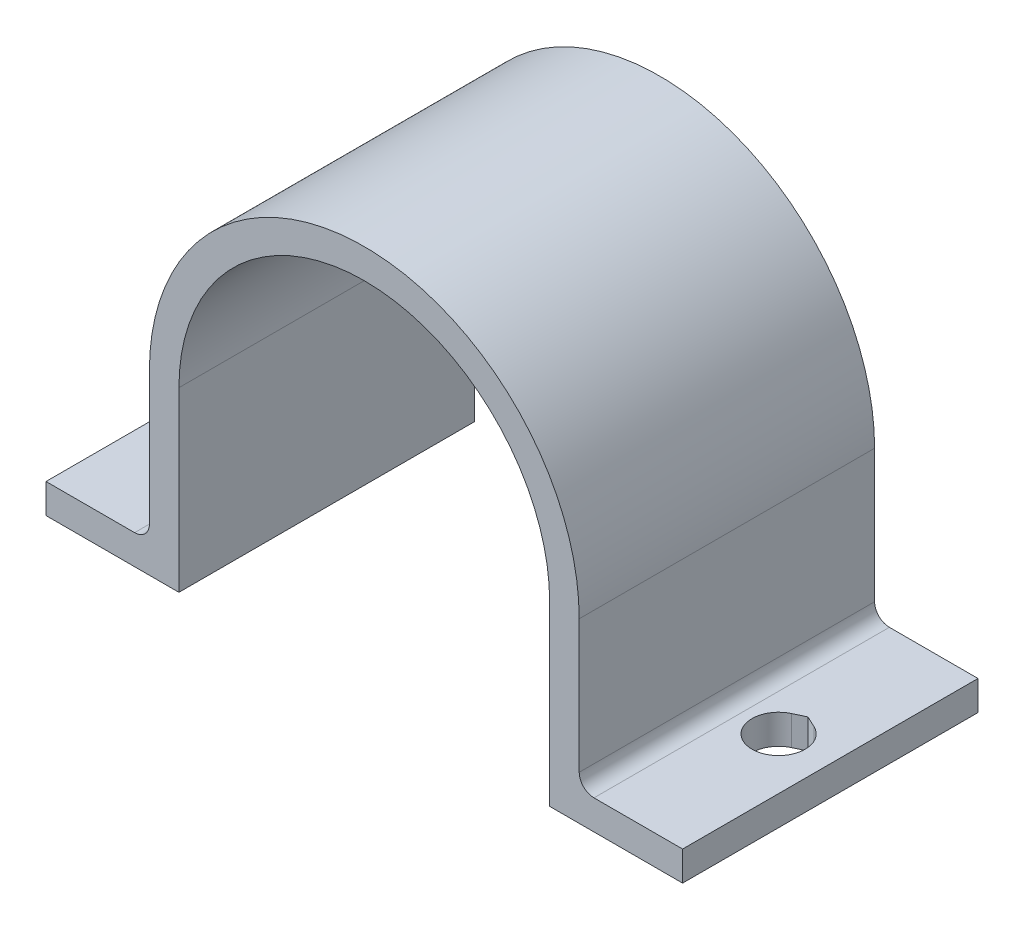
ISO-10303-21;
HEADER;
FILE_DESCRIPTION(('STEP AP214'),'2;1');
FILE_NAME('part.step','',(''),(''),'','','');
FILE_SCHEMA(('AUTOMOTIVE_DESIGN { 1 0 10303 214 1 1 1 1 }'));
ENDSEC;
DATA;
#1=APPLICATION_CONTEXT('core data for automotive mechanical design processes');
#2=APPLICATION_PROTOCOL_DEFINITION('international standard','automotive_design',2000,#1);
#3=PRODUCT_CONTEXT('',#1,'mechanical');
#4=PRODUCT('Part','Part','',(#3));
#5=PRODUCT_RELATED_PRODUCT_CATEGORY('part','',(#4));
#6=PRODUCT_DEFINITION_FORMATION('','',#4);
#7=PRODUCT_DEFINITION_CONTEXT('part definition',#1,'design');
#8=PRODUCT_DEFINITION('design','',#6,#7);
#9=PRODUCT_DEFINITION_SHAPE('','',#8);
#10=(LENGTH_UNIT() NAMED_UNIT(*) SI_UNIT(.MILLI.,.METRE.));
#11=(NAMED_UNIT(*) PLANE_ANGLE_UNIT() SI_UNIT($,.RADIAN.));
#12=(NAMED_UNIT(*) SI_UNIT($,.STERADIAN.) SOLID_ANGLE_UNIT());
#13=UNCERTAINTY_MEASURE_WITH_UNIT(LENGTH_MEASURE(1.E-05),#10,'distance_accuracy_value','');
#14=(GEOMETRIC_REPRESENTATION_CONTEXT(3) GLOBAL_UNCERTAINTY_ASSIGNED_CONTEXT((#13)) GLOBAL_UNIT_ASSIGNED_CONTEXT((#10,
#11,#12)) REPRESENTATION_CONTEXT('',''));
#15=CARTESIAN_POINT('',(0.,0.,0.));
#16=DIRECTION('',(0.,0.,1.));
#17=DIRECTION('',(1.,0.,0.));
#18=AXIS2_PLACEMENT_3D('',#15,#16,#17);
#19=CARTESIAN_POINT('',(0.,0.,20.));
#20=DIRECTION('',(0.,-1.,0.));
#21=DIRECTION('',(1.,0.,0.));
#22=AXIS2_PLACEMENT_3D('',#19,#20,#21);
#23=PLANE('',#22);
#24=DIRECTION('',(-1.,0.,0.));
#25=VECTOR('',#24,1.);
#26=CARTESIAN_POINT('',(0.,0.,0.));
#27=LINE('',#26,#25);
#28=CARTESIAN_POINT('',(-12.55,0.,0.));
#29=VERTEX_POINT('',#28);
#30=CARTESIAN_POINT('',(-21.55,0.,0.));
#31=VERTEX_POINT('',#30);
#32=EDGE_CURVE('E273',#29,#31,#27,.T.);
#33=ORIENTED_EDGE('',*,*,#32,.F.);
#34=DIRECTION('',(0.,0.,-1.));
#35=VECTOR('',#34,1.);
#36=CARTESIAN_POINT('',(-12.55,0.,20.));
#37=LINE('',#36,#35);
#38=CARTESIAN_POINT('',(-12.55,0.,20.));
#39=VERTEX_POINT('',#38);
#40=EDGE_CURVE('E325',#39,#29,#37,.T.);
#41=ORIENTED_EDGE('',*,*,#40,.F.);
#42=DIRECTION('',(-1.,0.,0.));
#43=VECTOR('',#42,1.);
#44=CARTESIAN_POINT('',(0.,0.,20.));
#45=LINE('',#44,#43);
#46=CARTESIAN_POINT('',(-21.55,0.,20.));
#47=VERTEX_POINT('',#46);
#48=EDGE_CURVE('E237',#39,#47,#45,.T.);
#49=ORIENTED_EDGE('',*,*,#48,.T.);
#50=DIRECTION('',(0.,0.,-1.));
#51=VECTOR('',#50,1.);
#52=CARTESIAN_POINT('',(-21.55,0.,20.));
#53=LINE('',#52,#51);
#54=EDGE_CURVE('E324',#47,#31,#53,.T.);
#55=ORIENTED_EDGE('',*,*,#54,.T.);
#56=EDGE_LOOP('',(#33,#41,#49,#55));
#57=FACE_BOUND('',#56,.T.);
#58=CARTESIAN_POINT('',(-18.05,0.,10.));
#59=DIRECTION('',(0.,-1.,0.));
#60=DIRECTION('',(1.,0.,0.));
#61=AXIS2_PLACEMENT_3D('',#58,#59,#60);
#62=CIRCLE('',#61,1.8);
#63=CARTESIAN_POINT('',(-17.2848986356513,0.,8.37069956660176));
#64=VERTEX_POINT('',#63);
#65=CARTESIAN_POINT('',(-18.8151013643487,0.,8.37069956660176));
#66=VERTEX_POINT('',#65);
#67=EDGE_CURVE('E216',#64,#66,#62,.T.);
#68=ORIENTED_EDGE('',*,*,#67,.F.);
#69=DIRECTION('',(-0.905166907443468,0.,-0.425056313527076));
#70=VECTOR('',#69,1.);
#71=CARTESIAN_POINT('',(-17.2848986356513,0.,8.37069956660176));
#72=LINE('',#71,#70);
#73=CARTESIAN_POINT('',(-18.05,0.,8.01141647446671));
#74=VERTEX_POINT('',#73);
#75=EDGE_CURVE('E72',#64,#74,#72,.T.);
#76=ORIENTED_EDGE('',*,*,#75,.T.);
#77=DIRECTION('',(-0.905166907443468,0.,0.425056313527076));
#78=VECTOR('',#77,1.);
#79=CARTESIAN_POINT('',(-18.8151013643487,0.,8.37069956660176));
#80=LINE('',#79,#78);
#81=EDGE_CURVE('E464',#74,#66,#80,.T.);
#82=ORIENTED_EDGE('',*,*,#81,.T.);
#83=EDGE_LOOP('',(#68,#76,#82));
#84=FACE_BOUND('',#83,.T.);
#85=ADVANCED_FACE('F50',(#57,#84),#23,.T.);
#86=CARTESIAN_POINT('',(0.,2.,20.));
#87=DIRECTION('',(0.,-1.,0.));
#88=DIRECTION('',(1.,0.,0.));
#89=AXIS2_PLACEMENT_3D('',#86,#87,#88);
#90=PLANE('',#89);
#91=DIRECTION('',(-1.,0.,0.));
#92=VECTOR('',#91,1.);
#93=CARTESIAN_POINT('',(0.,2.,0.));
#94=LINE('',#93,#92);
#95=CARTESIAN_POINT('',(21.55,2.00000000000002,0.));
#96=VERTEX_POINT('',#95);
#97=CARTESIAN_POINT('',(15.55,2.00000000000001,0.));
#98=VERTEX_POINT('',#97);
#99=EDGE_CURVE('E293',#96,#98,#94,.T.);
#100=ORIENTED_EDGE('',*,*,#99,.T.);
#101=DIRECTION('',(0.,0.,-1.));
#102=VECTOR('',#101,1.);
#103=CARTESIAN_POINT('',(15.55,2.00000000000001,20.));
#104=LINE('',#103,#102);
#105=CARTESIAN_POINT('',(15.55,2.00000000000001,20.));
#106=VERTEX_POINT('',#105);
#107=EDGE_CURVE('E336',#98,#106,#104,.F.);
#108=ORIENTED_EDGE('',*,*,#107,.T.);
#109=DIRECTION('',(-1.,0.,0.));
#110=VECTOR('',#109,1.);
#111=CARTESIAN_POINT('',(0.,2.,20.));
#112=LINE('',#111,#110);
#113=CARTESIAN_POINT('',(21.55,2.00000000000002,20.));
#114=VERTEX_POINT('',#113);
#115=EDGE_CURVE('E258',#114,#106,#112,.T.);
#116=ORIENTED_EDGE('',*,*,#115,.F.);
#117=DIRECTION('',(0.,0.,-1.));
#118=VECTOR('',#117,1.);
#119=CARTESIAN_POINT('',(21.55,2.00000000000002,20.));
#120=LINE('',#119,#118);
#121=EDGE_CURVE('E303',#114,#96,#120,.T.);
#122=ORIENTED_EDGE('',*,*,#121,.T.);
#123=EDGE_LOOP('',(#100,#108,#116,#122));
#124=FACE_BOUND('',#123,.T.);
#125=CARTESIAN_POINT('',(18.05,2.,10.));
#126=DIRECTION('',(0.,1.,0.));
#127=DIRECTION('',(0.,0.,1.));
#128=AXIS2_PLACEMENT_3D('',#125,#126,#127);
#129=CIRCLE('',#128,1.8);
#130=CARTESIAN_POINT('',(17.2848986356513,2.,8.37069956660176));
#131=VERTEX_POINT('',#130);
#132=CARTESIAN_POINT('',(18.8151013643487,2.,8.37069956660176));
#133=VERTEX_POINT('',#132);
#134=EDGE_CURVE('E207',#131,#133,#129,.T.);
#135=ORIENTED_EDGE('',*,*,#134,.F.);
#136=DIRECTION('',(0.905166907443468,0.,-0.425056313527076));
#137=VECTOR('',#136,1.);
#138=CARTESIAN_POINT('',(17.2848986356513,2.,8.37069956660176));
#139=LINE('',#138,#137);
#140=CARTESIAN_POINT('',(18.05,2.,8.01141647446671));
#141=VERTEX_POINT('',#140);
#142=EDGE_CURVE('E188',#131,#141,#139,.T.);
#143=ORIENTED_EDGE('',*,*,#142,.T.);
#144=DIRECTION('',(0.905166907443468,0.,0.425056313527076));
#145=VECTOR('',#144,1.);
#146=CARTESIAN_POINT('',(18.8151013643487,2.,8.37069956660176));
#147=LINE('',#146,#145);
#148=EDGE_CURVE('E197',#141,#133,#147,.T.);
#149=ORIENTED_EDGE('',*,*,#148,.T.);
#150=EDGE_LOOP('',(#135,#143,#149));
#151=FACE_BOUND('',#150,.T.);
#152=ADVANCED_FACE('F410',(#124,#151),#90,.F.);
#153=CARTESIAN_POINT('',(0.,12.,20.));
#154=DIRECTION('',(0.,0.,-1.));
#155=DIRECTION('',(-1.,0.,0.));
#156=AXIS2_PLACEMENT_3D('',#153,#154,#155);
#157=CYLINDRICAL_SURFACE('',#156,14.55);
#158=CARTESIAN_POINT('',(0.,12.,0.));
#159=DIRECTION('',(0.,0.,1.));
#160=DIRECTION('',(1.,0.,0.));
#161=AXIS2_PLACEMENT_3D('',#158,#159,#160);
#162=CIRCLE('',#161,14.55);
#163=CARTESIAN_POINT('',(-14.55,12.,0.));
#164=VERTEX_POINT('',#163);
#165=CARTESIAN_POINT('',(14.55,12.,0.));
#166=VERTEX_POINT('',#165);
#167=EDGE_CURVE('E208',#164,#166,#162,.F.);
#168=ORIENTED_EDGE('',*,*,#167,.F.);
#169=DIRECTION('',(0.,0.,-1.));
#170=VECTOR('',#169,1.);
#171=CARTESIAN_POINT('',(-14.55,12.,20.));
#172=LINE('',#171,#170);
#173=CARTESIAN_POINT('',(-14.55,12.,20.));
#174=VERTEX_POINT('',#173);
#175=EDGE_CURVE('E332',#174,#164,#172,.T.);
#176=ORIENTED_EDGE('',*,*,#175,.F.);
#177=CARTESIAN_POINT('',(0.,12.,20.));
#178=DIRECTION('',(0.,0.,1.));
#179=DIRECTION('',(1.,0.,0.));
#180=AXIS2_PLACEMENT_3D('',#177,#178,#179);
#181=CIRCLE('',#180,14.55);
#182=CARTESIAN_POINT('',(14.55,12.,20.));
#183=VERTEX_POINT('',#182);
#184=EDGE_CURVE('E219',#174,#183,#181,.F.);
#185=ORIENTED_EDGE('',*,*,#184,.T.);
#186=DIRECTION('',(0.,0.,-1.));
#187=VECTOR('',#186,1.);
#188=CARTESIAN_POINT('',(14.55,12.,20.));
#189=LINE('',#188,#187);
#190=EDGE_CURVE('E265',#183,#166,#189,.T.);
#191=ORIENTED_EDGE('',*,*,#190,.T.);
#192=EDGE_LOOP('',(#168,#176,#185,#191));
#193=FACE_BOUND('',#192,.T.);
#194=ADVANCED_FACE('F419',(#193),#157,.T.);
#195=CARTESIAN_POINT('',(-14.55,0.,20.));
#196=DIRECTION('',(-1.,0.,0.));
#197=DIRECTION('',(0.,-1.,0.));
#198=AXIS2_PLACEMENT_3D('',#195,#196,#197);
#199=PLANE('',#198);
#200=DIRECTION('',(0.,1.,0.));
#201=VECTOR('',#200,1.);
#202=CARTESIAN_POINT('',(-14.55,0.,0.));
#203=LINE('',#202,#201);
#204=CARTESIAN_POINT('',(-14.55,3.,0.));
#205=VERTEX_POINT('',#204);
#206=EDGE_CURVE('E212',#205,#164,#203,.T.);
#207=ORIENTED_EDGE('',*,*,#206,.F.);
#208=DIRECTION('',(0.,0.,-1.));
#209=VECTOR('',#208,1.);
#210=CARTESIAN_POINT('',(-14.55,3.,20.));
#211=LINE('',#210,#209);
#212=CARTESIAN_POINT('',(-14.55,3.,20.));
#213=VERTEX_POINT('',#212);
#214=EDGE_CURVE('E347',#205,#213,#211,.F.);
#215=ORIENTED_EDGE('',*,*,#214,.T.);
#216=DIRECTION('',(0.,1.,0.));
#217=VECTOR('',#216,1.);
#218=CARTESIAN_POINT('',(-14.55,0.,20.));
#219=LINE('',#218,#217);
#220=EDGE_CURVE('E221',#213,#174,#219,.T.);
#221=ORIENTED_EDGE('',*,*,#220,.T.);
#222=ORIENTED_EDGE('',*,*,#175,.T.);
#223=EDGE_LOOP('',(#207,#215,#221,#222));
#224=FACE_BOUND('',#223,.T.);
#225=ADVANCED_FACE('F361',(#224),#199,.T.);
#226=CARTESIAN_POINT('',(0.,2.,20.));
#227=DIRECTION('',(0.,1.,0.));
#228=DIRECTION('',(0.,0.,1.));
#229=AXIS2_PLACEMENT_3D('',#226,#227,#228);
#230=PLANE('',#229);
#231=DIRECTION('',(-0.905166907443468,0.,-0.425056313527076));
#232=VECTOR('',#231,1.);
#233=CARTESIAN_POINT('',(-17.2848986356513,2.,8.37069956660176));
#234=LINE('',#233,#232);
#235=CARTESIAN_POINT('',(-17.2848986356513,2.,8.37069956660176));
#236=VERTEX_POINT('',#235);
#237=CARTESIAN_POINT('',(-18.05,2.,8.01141647446671));
#238=VERTEX_POINT('',#237);
#239=EDGE_CURVE('E450',#236,#238,#234,.T.);
#240=ORIENTED_EDGE('',*,*,#239,.F.);
#241=CARTESIAN_POINT('',(-18.05,2.,10.));
#242=DIRECTION('',(0.,1.,0.));
#243=DIRECTION('',(0.,0.,1.));
#244=AXIS2_PLACEMENT_3D('',#241,#242,#243);
#245=CIRCLE('',#244,1.8);
#246=CARTESIAN_POINT('',(-18.8151013643487,2.,8.37069956660176));
#247=VERTEX_POINT('',#246);
#248=EDGE_CURVE('E448',#247,#236,#245,.T.);
#249=ORIENTED_EDGE('',*,*,#248,.F.);
#250=DIRECTION('',(-0.905166907443468,0.,0.425056313527076));
#251=VECTOR('',#250,1.);
#252=CARTESIAN_POINT('',(-18.8151013643487,2.,8.37069956660176));
#253=LINE('',#252,#251);
#254=EDGE_CURVE('E451',#238,#247,#253,.T.);
#255=ORIENTED_EDGE('',*,*,#254,.F.);
#256=EDGE_LOOP('',(#240,#249,#255));
#257=FACE_BOUND('',#256,.T.);
#258=DIRECTION('',(1.,0.,0.));
#259=VECTOR('',#258,1.);
#260=CARTESIAN_POINT('',(0.,2.,20.));
#261=LINE('',#260,#259);
#262=CARTESIAN_POINT('',(-21.55,2.,20.));
#263=VERTEX_POINT('',#262);
#264=CARTESIAN_POINT('',(-15.55,2.,20.));
#265=VERTEX_POINT('',#264);
#266=EDGE_CURVE('E230',#263,#265,#261,.T.);
#267=ORIENTED_EDGE('',*,*,#266,.T.);
#268=DIRECTION('',(0.,0.,-1.));
#269=VECTOR('',#268,1.);
#270=CARTESIAN_POINT('',(-15.55,2.,0.));
#271=LINE('',#270,#269);
#272=CARTESIAN_POINT('',(-15.55,2.,0.));
#273=VERTEX_POINT('',#272);
#274=EDGE_CURVE('E345',#265,#273,#271,.T.);
#275=ORIENTED_EDGE('',*,*,#274,.T.);
#276=DIRECTION('',(1.,0.,0.));
#277=VECTOR('',#276,1.);
#278=CARTESIAN_POINT('',(0.,2.,0.));
#279=LINE('',#278,#277);
#280=CARTESIAN_POINT('',(-21.55,2.,0.));
#281=VERTEX_POINT('',#280);
#282=EDGE_CURVE('E266',#281,#273,#279,.T.);
#283=ORIENTED_EDGE('',*,*,#282,.F.);
#284=DIRECTION('',(0.,0.,-1.));
#285=VECTOR('',#284,1.);
#286=CARTESIAN_POINT('',(-21.55,2.,20.));
#287=LINE('',#286,#285);
#288=EDGE_CURVE('E327',#263,#281,#287,.T.);
#289=ORIENTED_EDGE('',*,*,#288,.F.);
#290=EDGE_LOOP('',(#267,#275,#283,#289));
#291=FACE_BOUND('',#290,.T.);
#292=ADVANCED_FACE('F372',(#257,#291),#230,.T.);
#293=CARTESIAN_POINT('',(-21.55,0.,20.));
#294=DIRECTION('',(-1.,0.,0.));
#295=DIRECTION('',(0.,0.,1.));
#296=AXIS2_PLACEMENT_3D('',#293,#294,#295);
#297=PLANE('',#296);
#298=DIRECTION('',(0.,1.,0.));
#299=VECTOR('',#298,1.);
#300=CARTESIAN_POINT('',(-21.55,0.,0.));
#301=LINE('',#300,#299);
#302=EDGE_CURVE('E269',#31,#281,#301,.T.);
#303=ORIENTED_EDGE('',*,*,#302,.F.);
#304=ORIENTED_EDGE('',*,*,#54,.F.);
#305=DIRECTION('',(0.,1.,0.));
#306=VECTOR('',#305,1.);
#307=CARTESIAN_POINT('',(-21.55,0.,20.));
#308=LINE('',#307,#306);
#309=EDGE_CURVE('E235',#47,#263,#308,.T.);
#310=ORIENTED_EDGE('',*,*,#309,.T.);
#311=ORIENTED_EDGE('',*,*,#288,.T.);
#312=EDGE_LOOP('',(#303,#304,#310,#311));
#313=FACE_BOUND('',#312,.T.);
#314=ADVANCED_FACE('F380',(#313),#297,.T.);
#315=CARTESIAN_POINT('',(-12.55,0.,20.));
#316=DIRECTION('',(-1.,0.,0.));
#317=DIRECTION('',(0.,0.,1.));
#318=AXIS2_PLACEMENT_3D('',#315,#316,#317);
#319=PLANE('',#318);
#320=DIRECTION('',(0.,1.,0.));
#321=VECTOR('',#320,1.);
#322=CARTESIAN_POINT('',(-12.55,0.,0.));
#323=LINE('',#322,#321);
#324=CARTESIAN_POINT('',(-12.55,12.,0.));
#325=VERTEX_POINT('',#324);
#326=EDGE_CURVE('E279',#29,#325,#323,.T.);
#327=ORIENTED_EDGE('',*,*,#326,.T.);
#328=DIRECTION('',(0.,0.,-1.));
#329=VECTOR('',#328,1.);
#330=CARTESIAN_POINT('',(-12.55,12.,20.));
#331=LINE('',#330,#329);
#332=CARTESIAN_POINT('',(-12.55,12.,20.));
#333=VERTEX_POINT('',#332);
#334=EDGE_CURVE('E318',#333,#325,#331,.T.);
#335=ORIENTED_EDGE('',*,*,#334,.F.);
#336=DIRECTION('',(0.,1.,0.));
#337=VECTOR('',#336,1.);
#338=CARTESIAN_POINT('',(-12.55,0.,20.));
#339=LINE('',#338,#337);
#340=EDGE_CURVE('E238',#39,#333,#339,.T.);
#341=ORIENTED_EDGE('',*,*,#340,.F.);
#342=ORIENTED_EDGE('',*,*,#40,.T.);
#343=EDGE_LOOP('',(#327,#335,#341,#342));
#344=FACE_BOUND('',#343,.T.);
#345=ADVANCED_FACE('F387',(#344),#319,.F.);
#346=CARTESIAN_POINT('',(0.,12.,20.));
#347=DIRECTION('',(0.,0.,-1.));
#348=DIRECTION('',(-1.,0.,0.));
#349=AXIS2_PLACEMENT_3D('',#346,#347,#348);
#350=CYLINDRICAL_SURFACE('',#349,12.55);
#351=CARTESIAN_POINT('',(0.,12.,0.));
#352=DIRECTION('',(0.,0.,1.));
#353=DIRECTION('',(1.,0.,0.));
#354=AXIS2_PLACEMENT_3D('',#351,#352,#353);
#355=CIRCLE('',#354,12.55);
#356=CARTESIAN_POINT('',(12.55,12.,0.));
#357=VERTEX_POINT('',#356);
#358=EDGE_CURVE('E282',#325,#357,#355,.F.);
#359=ORIENTED_EDGE('',*,*,#358,.T.);
#360=DIRECTION('',(0.,0.,-1.));
#361=VECTOR('',#360,1.);
#362=CARTESIAN_POINT('',(12.55,12.,20.));
#363=LINE('',#362,#361);
#364=CARTESIAN_POINT('',(12.55,12.,20.));
#365=VERTEX_POINT('',#364);
#366=EDGE_CURVE('E312',#365,#357,#363,.T.);
#367=ORIENTED_EDGE('',*,*,#366,.F.);
#368=CARTESIAN_POINT('',(0.,12.,20.));
#369=DIRECTION('',(0.,0.,1.));
#370=DIRECTION('',(1.,0.,0.));
#371=AXIS2_PLACEMENT_3D('',#368,#369,#370);
#372=CIRCLE('',#371,12.55);
#373=EDGE_CURVE('E245',#333,#365,#372,.F.);
#374=ORIENTED_EDGE('',*,*,#373,.F.);
#375=ORIENTED_EDGE('',*,*,#334,.T.);
#376=EDGE_LOOP('',(#359,#367,#374,#375));
#377=FACE_BOUND('',#376,.T.);
#378=ADVANCED_FACE('F392',(#377),#350,.F.);
#379=CARTESIAN_POINT('',(12.55,0.,20.));
#380=DIRECTION('',(-1.,0.,0.));
#381=DIRECTION('',(0.,-1.,0.));
#382=AXIS2_PLACEMENT_3D('',#379,#380,#381);
#383=PLANE('',#382);
#384=DIRECTION('',(0.,1.,0.));
#385=VECTOR('',#384,1.);
#386=CARTESIAN_POINT('',(12.55,0.,0.));
#387=LINE('',#386,#385);
#388=CARTESIAN_POINT('',(12.55,0.,0.));
#389=VERTEX_POINT('',#388);
#390=EDGE_CURVE('E283',#389,#357,#387,.T.);
#391=ORIENTED_EDGE('',*,*,#390,.F.);
#392=DIRECTION('',(0.,0.,-1.));
#393=VECTOR('',#392,1.);
#394=CARTESIAN_POINT('',(12.55,0.,20.));
#395=LINE('',#394,#393);
#396=CARTESIAN_POINT('',(12.55,0.,20.));
#397=VERTEX_POINT('',#396);
#398=EDGE_CURVE('E315',#397,#389,#395,.T.);
#399=ORIENTED_EDGE('',*,*,#398,.F.);
#400=DIRECTION('',(0.,1.,0.));
#401=VECTOR('',#400,1.);
#402=CARTESIAN_POINT('',(12.55,0.,20.));
#403=LINE('',#402,#401);
#404=EDGE_CURVE('E246',#397,#365,#403,.T.);
#405=ORIENTED_EDGE('',*,*,#404,.T.);
#406=ORIENTED_EDGE('',*,*,#366,.T.);
#407=EDGE_LOOP('',(#391,#399,#405,#406));
#408=FACE_BOUND('',#407,.T.);
#409=ADVANCED_FACE('F393',(#408),#383,.T.);
#410=CARTESIAN_POINT('',(0.,0.,20.));
#411=DIRECTION('',(0.,1.,0.));
#412=DIRECTION('',(-1.,0.,0.));
#413=AXIS2_PLACEMENT_3D('',#410,#411,#412);
#414=PLANE('',#413);
#415=DIRECTION('',(-0.905166907443468,0.,-0.425056313527076));
#416=VECTOR('',#415,1.);
#417=CARTESIAN_POINT('',(18.8151013643487,0.,8.37069956660176));
#418=LINE('',#417,#416);
#419=CARTESIAN_POINT('',(18.8151013643487,0.,8.37069956660175));
#420=VERTEX_POINT('',#419);
#421=CARTESIAN_POINT('',(18.05,0.,8.01141647446671));
#422=VERTEX_POINT('',#421);
#423=EDGE_CURVE('E65',#420,#422,#418,.T.);
#424=ORIENTED_EDGE('',*,*,#423,.T.);
#425=DIRECTION('',(-0.905166907443468,0.,0.425056313527076));
#426=VECTOR('',#425,1.);
#427=CARTESIAN_POINT('',(17.2848986356513,0.,8.37069956660176));
#428=LINE('',#427,#426);
#429=CARTESIAN_POINT('',(17.2848986356513,0.,8.37069956660176));
#430=VERTEX_POINT('',#429);
#431=EDGE_CURVE('E190',#422,#430,#428,.T.);
#432=ORIENTED_EDGE('',*,*,#431,.T.);
#433=CARTESIAN_POINT('',(18.05,0.,10.));
#434=DIRECTION('',(0.,1.,0.));
#435=DIRECTION('',(-1.,0.,0.));
#436=AXIS2_PLACEMENT_3D('',#433,#434,#435);
#437=CIRCLE('',#436,1.8);
#438=EDGE_CURVE('E201',#430,#420,#437,.T.);
#439=ORIENTED_EDGE('',*,*,#438,.T.);
#440=EDGE_LOOP('',(#424,#432,#439));
#441=FACE_BOUND('',#440,.T.);
#442=DIRECTION('',(1.,0.,0.));
#443=VECTOR('',#442,1.);
#444=CARTESIAN_POINT('',(0.,0.,0.));
#445=LINE('',#444,#443);
#446=CARTESIAN_POINT('',(21.55,0.,0.));
#447=VERTEX_POINT('',#446);
#448=EDGE_CURVE('E288',#389,#447,#445,.T.);
#449=ORIENTED_EDGE('',*,*,#448,.T.);
#450=DIRECTION('',(0.,0.,-1.));
#451=VECTOR('',#450,1.);
#452=CARTESIAN_POINT('',(21.55,0.,20.));
#453=LINE('',#452,#451);
#454=CARTESIAN_POINT('',(21.55,0.,20.));
#455=VERTEX_POINT('',#454);
#456=EDGE_CURVE('E306',#455,#447,#453,.T.);
#457=ORIENTED_EDGE('',*,*,#456,.F.);
#458=DIRECTION('',(1.,0.,0.));
#459=VECTOR('',#458,1.);
#460=CARTESIAN_POINT('',(0.,0.,20.));
#461=LINE('',#460,#459);
#462=EDGE_CURVE('E249',#397,#455,#461,.T.);
#463=ORIENTED_EDGE('',*,*,#462,.F.);
#464=ORIENTED_EDGE('',*,*,#398,.T.);
#465=EDGE_LOOP('',(#449,#457,#463,#464));
#466=FACE_BOUND('',#465,.T.);
#467=ADVANCED_FACE('F203',(#441,#466),#414,.F.);
#468=CARTESIAN_POINT('',(21.55,0.,20.));
#469=DIRECTION('',(-1.,0.,0.));
#470=DIRECTION('',(0.,0.,1.));
#471=AXIS2_PLACEMENT_3D('',#468,#469,#470);
#472=PLANE('',#471);
#473=DIRECTION('',(0.,1.,0.));
#474=VECTOR('',#473,1.);
#475=CARTESIAN_POINT('',(21.55,0.,0.));
#476=LINE('',#475,#474);
#477=EDGE_CURVE('E295',#447,#96,#476,.T.);
#478=ORIENTED_EDGE('',*,*,#477,.T.);
#479=ORIENTED_EDGE('',*,*,#121,.F.);
#480=DIRECTION('',(0.,1.,0.));
#481=VECTOR('',#480,1.);
#482=CARTESIAN_POINT('',(21.55,0.,20.));
#483=LINE('',#482,#481);
#484=EDGE_CURVE('E251',#455,#114,#483,.T.);
#485=ORIENTED_EDGE('',*,*,#484,.F.);
#486=ORIENTED_EDGE('',*,*,#456,.T.);
#487=EDGE_LOOP('',(#478,#479,#485,#486));
#488=FACE_BOUND('',#487,.T.);
#489=ADVANCED_FACE('F404',(#488),#472,.F.);
#490=CARTESIAN_POINT('',(14.55,0.,20.));
#491=DIRECTION('',(-1.,0.,0.));
#492=DIRECTION('',(0.,-1.,0.));
#493=AXIS2_PLACEMENT_3D('',#490,#491,#492);
#494=PLANE('',#493);
#495=DIRECTION('',(0.,1.,0.));
#496=VECTOR('',#495,1.);
#497=CARTESIAN_POINT('',(14.55,0.,20.));
#498=LINE('',#497,#496);
#499=CARTESIAN_POINT('',(14.55,3.00000000000001,20.));
#500=VERTEX_POINT('',#499);
#501=EDGE_CURVE('E257',#500,#183,#498,.T.);
#502=ORIENTED_EDGE('',*,*,#501,.F.);
#503=DIRECTION('',(0.,0.,-1.));
#504=VECTOR('',#503,1.);
#505=CARTESIAN_POINT('',(14.55,3.00000000000001,0.));
#506=LINE('',#505,#504);
#507=CARTESIAN_POINT('',(14.55,3.00000000000001,0.));
#508=VERTEX_POINT('',#507);
#509=EDGE_CURVE('E333',#500,#508,#506,.T.);
#510=ORIENTED_EDGE('',*,*,#509,.T.);
#511=DIRECTION('',(0.,1.,0.));
#512=VECTOR('',#511,1.);
#513=CARTESIAN_POINT('',(14.55,0.,0.));
#514=LINE('',#513,#512);
#515=EDGE_CURVE('E223',#508,#166,#514,.T.);
#516=ORIENTED_EDGE('',*,*,#515,.T.);
#517=ORIENTED_EDGE('',*,*,#190,.F.);
#518=EDGE_LOOP('',(#502,#510,#516,#517));
#519=FACE_BOUND('',#518,.T.);
#520=ADVANCED_FACE('F417',(#519),#494,.F.);
#521=CARTESIAN_POINT('',(0.,0.,20.));
#522=DIRECTION('',(0.,0.,1.));
#523=DIRECTION('',(1.,0.,0.));
#524=AXIS2_PLACEMENT_3D('',#521,#522,#523);
#525=PLANE('',#524);
#526=ORIENTED_EDGE('',*,*,#184,.F.);
#527=ORIENTED_EDGE('',*,*,#220,.F.);
#528=CARTESIAN_POINT('',(-15.55,3.,20.));
#529=DIRECTION('',(0.,0.,1.));
#530=DIRECTION('',(1.,0.,0.));
#531=AXIS2_PLACEMENT_3D('',#528,#529,#530);
#532=CIRCLE('',#531,1.);
#533=EDGE_CURVE('E11',#213,#265,#532,.F.);
#534=ORIENTED_EDGE('',*,*,#533,.T.);
#535=ORIENTED_EDGE('',*,*,#266,.F.);
#536=ORIENTED_EDGE('',*,*,#309,.F.);
#537=ORIENTED_EDGE('',*,*,#48,.F.);
#538=ORIENTED_EDGE('',*,*,#340,.T.);
#539=ORIENTED_EDGE('',*,*,#373,.T.);
#540=ORIENTED_EDGE('',*,*,#404,.F.);
#541=ORIENTED_EDGE('',*,*,#462,.T.);
#542=ORIENTED_EDGE('',*,*,#484,.T.);
#543=ORIENTED_EDGE('',*,*,#115,.T.);
#544=CARTESIAN_POINT('',(15.55,3.00000000000001,20.));
#545=DIRECTION('',(0.,0.,1.));
#546=DIRECTION('',(1.,0.,0.));
#547=AXIS2_PLACEMENT_3D('',#544,#545,#546);
#548=CIRCLE('',#547,1.);
#549=EDGE_CURVE('E354',#106,#500,#548,.F.);
#550=ORIENTED_EDGE('',*,*,#549,.T.);
#551=ORIENTED_EDGE('',*,*,#501,.T.);
#552=EDGE_LOOP('',(#526,#527,#534,#535,#536,#537,#538,#539,#540,#541,#542,#543,#550,#551));
#553=FACE_BOUND('',#552,.T.);
#554=ADVANCED_FACE('F371',(#553),#525,.T.);
#555=CARTESIAN_POINT('',(0.,0.,0.));
#556=DIRECTION('',(0.,0.,1.));
#557=DIRECTION('',(1.,0.,0.));
#558=AXIS2_PLACEMENT_3D('',#555,#556,#557);
#559=PLANE('',#558);
#560=ORIENTED_EDGE('',*,*,#167,.T.);
#561=ORIENTED_EDGE('',*,*,#515,.F.);
#562=CARTESIAN_POINT('',(15.55,3.00000000000001,0.));
#563=DIRECTION('',(0.,0.,1.));
#564=DIRECTION('',(1.,0.,0.));
#565=AXIS2_PLACEMENT_3D('',#562,#563,#564);
#566=CIRCLE('',#565,1.);
#567=EDGE_CURVE('E349',#508,#98,#566,.T.);
#568=ORIENTED_EDGE('',*,*,#567,.T.);
#569=ORIENTED_EDGE('',*,*,#99,.F.);
#570=ORIENTED_EDGE('',*,*,#477,.F.);
#571=ORIENTED_EDGE('',*,*,#448,.F.);
#572=ORIENTED_EDGE('',*,*,#390,.T.);
#573=ORIENTED_EDGE('',*,*,#358,.F.);
#574=ORIENTED_EDGE('',*,*,#326,.F.);
#575=ORIENTED_EDGE('',*,*,#32,.T.);
#576=ORIENTED_EDGE('',*,*,#302,.T.);
#577=ORIENTED_EDGE('',*,*,#282,.T.);
#578=CARTESIAN_POINT('',(-15.55,3.,0.));
#579=DIRECTION('',(0.,0.,1.));
#580=DIRECTION('',(1.,0.,0.));
#581=AXIS2_PLACEMENT_3D('',#578,#579,#580);
#582=CIRCLE('',#581,1.);
#583=EDGE_CURVE('E57',#273,#205,#582,.T.);
#584=ORIENTED_EDGE('',*,*,#583,.T.);
#585=ORIENTED_EDGE('',*,*,#206,.T.);
#586=EDGE_LOOP('',(#560,#561,#568,#569,#570,#571,#572,#573,#574,#575,#576,#577,#584,#585));
#587=FACE_BOUND('',#586,.T.);
#588=ADVANCED_FACE('F360',(#587),#559,.F.);
#589=CARTESIAN_POINT('',(18.05,2.,10.));
#590=DIRECTION('',(0.,1.,0.));
#591=DIRECTION('',(0.,0.,1.));
#592=AXIS2_PLACEMENT_3D('',#589,#590,#591);
#593=CYLINDRICAL_SURFACE('',#592,1.8);
#594=ORIENTED_EDGE('',*,*,#438,.F.);
#595=DIRECTION('',(0.,1.,0.));
#596=VECTOR('',#595,1.);
#597=CARTESIAN_POINT('',(17.2848986356513,-0.00100000000000143,8.37069956660176));
#598=LINE('',#597,#596);
#599=EDGE_CURVE('E183',#430,#131,#598,.T.);
#600=ORIENTED_EDGE('',*,*,#599,.T.);
#601=ORIENTED_EDGE('',*,*,#134,.T.);
#602=DIRECTION('',(0.,1.,0.));
#603=VECTOR('',#602,1.);
#604=CARTESIAN_POINT('',(18.8151013643487,-0.00100000000000143,8.37069956660176));
#605=LINE('',#604,#603);
#606=EDGE_CURVE('E198',#420,#133,#605,.T.);
#607=ORIENTED_EDGE('',*,*,#606,.F.);
#608=EDGE_LOOP('',(#594,#600,#601,#607));
#609=FACE_BOUND('',#608,.T.);
#610=ADVANCED_FACE('F206',(#609),#593,.F.);
#611=CARTESIAN_POINT('',(-18.05,2.,10.));
#612=DIRECTION('',(0.,1.,0.));
#613=DIRECTION('',(0.,0.,1.));
#614=AXIS2_PLACEMENT_3D('',#611,#612,#613);
#615=CYLINDRICAL_SURFACE('',#614,1.8);
#616=ORIENTED_EDGE('',*,*,#67,.T.);
#617=DIRECTION('',(0.,1.,0.));
#618=VECTOR('',#617,1.);
#619=CARTESIAN_POINT('',(-18.8151013643487,-0.00100000000000143,8.37069956660176));
#620=LINE('',#619,#618);
#621=EDGE_CURVE('E458',#66,#247,#620,.T.);
#622=ORIENTED_EDGE('',*,*,#621,.T.);
#623=ORIENTED_EDGE('',*,*,#248,.T.);
#624=DIRECTION('',(0.,1.,0.));
#625=VECTOR('',#624,1.);
#626=CARTESIAN_POINT('',(-17.2848986356513,-0.00100000000000143,8.37069956660176));
#627=LINE('',#626,#625);
#628=EDGE_CURVE('E456',#64,#236,#627,.T.);
#629=ORIENTED_EDGE('',*,*,#628,.F.);
#630=EDGE_LOOP('',(#616,#622,#623,#629));
#631=FACE_BOUND('',#630,.T.);
#632=ADVANCED_FACE('F460',(#631),#615,.F.);
#633=CARTESIAN_POINT('',(15.55,3.00000000000001,20.));
#634=DIRECTION('',(0.,0.,1.));
#635=DIRECTION('',(1.,0.,0.));
#636=AXIS2_PLACEMENT_3D('',#633,#634,#635);
#637=CYLINDRICAL_SURFACE('',#636,1.);
#638=ORIENTED_EDGE('',*,*,#549,.F.);
#639=ORIENTED_EDGE('',*,*,#107,.F.);
#640=ORIENTED_EDGE('',*,*,#567,.F.);
#641=ORIENTED_EDGE('',*,*,#509,.F.);
#642=EDGE_LOOP('',(#638,#639,#640,#641));
#643=FACE_BOUND('',#642,.T.);
#644=ADVANCED_FACE('F415',(#643),#637,.F.);
#645=CARTESIAN_POINT('',(-15.55,3.,20.));
#646=DIRECTION('',(0.,0.,1.));
#647=DIRECTION('',(1.,0.,0.));
#648=AXIS2_PLACEMENT_3D('',#645,#646,#647);
#649=CYLINDRICAL_SURFACE('',#648,1.);
#650=ORIENTED_EDGE('',*,*,#533,.F.);
#651=ORIENTED_EDGE('',*,*,#214,.F.);
#652=ORIENTED_EDGE('',*,*,#583,.F.);
#653=ORIENTED_EDGE('',*,*,#274,.F.);
#654=EDGE_LOOP('',(#650,#651,#652,#653));
#655=FACE_BOUND('',#654,.T.);
#656=ADVANCED_FACE('F47',(#655),#649,.F.);
#657=CARTESIAN_POINT('',(-17.2848986356513,-0.00100000000000143,8.37069956660176));
#658=DIRECTION('',(0.425056313527076,0.,-0.905166907443468));
#659=DIRECTION('',(-0.905166907443468,0.,-0.425056313527076));
#660=AXIS2_PLACEMENT_3D('',#657,#658,#659);
#661=PLANE('',#660);
#662=ORIENTED_EDGE('',*,*,#628,.T.);
#663=ORIENTED_EDGE('',*,*,#239,.T.);
#664=DIRECTION('',(0.,1.,0.));
#665=VECTOR('',#664,1.);
#666=CARTESIAN_POINT('',(-18.05,-0.00100000000000143,8.01141647446671));
#667=LINE('',#666,#665);
#668=EDGE_CURVE('E468',#74,#238,#667,.T.);
#669=ORIENTED_EDGE('',*,*,#668,.F.);
#670=ORIENTED_EDGE('',*,*,#75,.F.);
#671=EDGE_LOOP('',(#662,#663,#669,#670));
#672=FACE_BOUND('',#671,.T.);
#673=ADVANCED_FACE('F505',(#672),#661,.F.);
#674=CARTESIAN_POINT('',(-18.8151013643487,-0.00100000000000143,8.37069956660176));
#675=DIRECTION('',(-0.425056313527076,0.,-0.905166907443468));
#676=DIRECTION('',(-0.905166907443468,0.,0.425056313527076));
#677=AXIS2_PLACEMENT_3D('',#674,#675,#676);
#678=PLANE('',#677);
#679=ORIENTED_EDGE('',*,*,#668,.T.);
#680=ORIENTED_EDGE('',*,*,#254,.T.);
#681=ORIENTED_EDGE('',*,*,#621,.F.);
#682=ORIENTED_EDGE('',*,*,#81,.F.);
#683=EDGE_LOOP('',(#679,#680,#681,#682));
#684=FACE_BOUND('',#683,.T.);
#685=ADVANCED_FACE('F499',(#684),#678,.F.);
#686=CARTESIAN_POINT('',(17.2848986356513,-0.00100000000000143,8.37069956660176));
#687=DIRECTION('',(0.425056313527076,0.,0.905166907443468));
#688=DIRECTION('',(0.905166907443468,0.,-0.425056313527076));
#689=AXIS2_PLACEMENT_3D('',#686,#687,#688);
#690=PLANE('',#689);
#691=DIRECTION('',(0.,1.,0.));
#692=VECTOR('',#691,1.);
#693=CARTESIAN_POINT('',(18.05,-0.00100000000000143,8.01141647446671));
#694=LINE('',#693,#692);
#695=EDGE_CURVE('E479',#422,#141,#694,.T.);
#696=ORIENTED_EDGE('',*,*,#695,.T.);
#697=ORIENTED_EDGE('',*,*,#142,.F.);
#698=ORIENTED_EDGE('',*,*,#599,.F.);
#699=ORIENTED_EDGE('',*,*,#431,.F.);
#700=EDGE_LOOP('',(#696,#697,#698,#699));
#701=FACE_BOUND('',#700,.T.);
#702=ADVANCED_FACE('F189',(#701),#690,.T.);
#703=CARTESIAN_POINT('',(18.8151013643487,-0.00100000000000143,8.37069956660176));
#704=DIRECTION('',(-0.425056313527076,0.,0.905166907443468));
#705=DIRECTION('',(0.905166907443468,0.,0.425056313527076));
#706=AXIS2_PLACEMENT_3D('',#703,#704,#705);
#707=PLANE('',#706);
#708=ORIENTED_EDGE('',*,*,#606,.T.);
#709=ORIENTED_EDGE('',*,*,#148,.F.);
#710=ORIENTED_EDGE('',*,*,#695,.F.);
#711=ORIENTED_EDGE('',*,*,#423,.F.);
#712=EDGE_LOOP('',(#708,#709,#710,#711));
#713=FACE_BOUND('',#712,.T.);
#714=ADVANCED_FACE('F495',(#713),#707,.T.);
#715=CLOSED_SHELL('',(#85,#152,#194,#225,#292,#314,#345,#378,#409,#467,#489,#520,#554,#588,#610,
#632,#644,#656,#673,#685,#702,#714));
#716=MANIFOLD_SOLID_BREP('B2',#715);
#717=ADVANCED_BREP_SHAPE_REPRESENTATION('',(#18,#716),#14);
#718=SHAPE_DEFINITION_REPRESENTATION(#9,#717);
ENDSEC;
END-ISO-10303-21;
